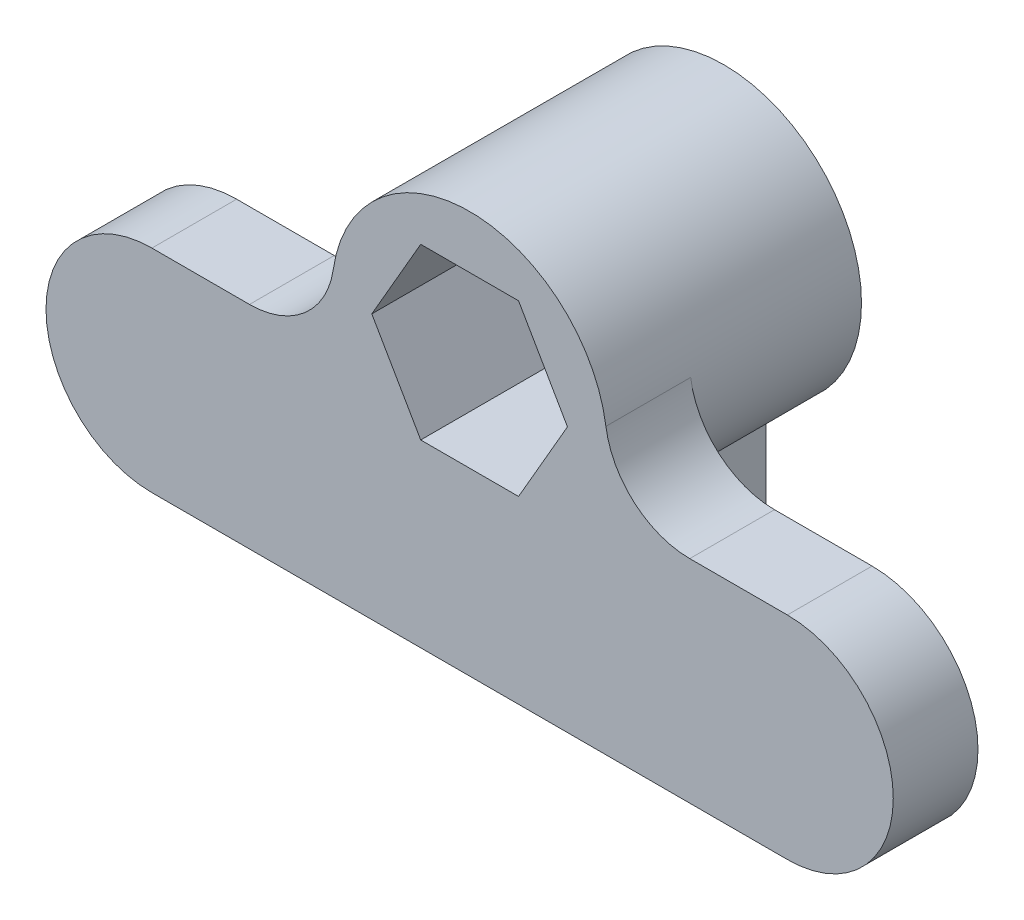
ISO-10303-21;
HEADER;
FILE_DESCRIPTION(('STEP AP214'),'2;1');
FILE_NAME('part.step','',(''),(''),'','','');
FILE_SCHEMA(('AUTOMOTIVE_DESIGN { 1 0 10303 214 1 1 1 1 }'));
ENDSEC;
DATA;
#1=APPLICATION_CONTEXT('core data for automotive mechanical design processes');
#2=APPLICATION_PROTOCOL_DEFINITION('international standard','automotive_design',2000,#1);
#3=PRODUCT_CONTEXT('',#1,'mechanical');
#4=PRODUCT('Part','Part','',(#3));
#5=PRODUCT_RELATED_PRODUCT_CATEGORY('part','',(#4));
#6=PRODUCT_DEFINITION_FORMATION('','',#4);
#7=PRODUCT_DEFINITION_CONTEXT('part definition',#1,'design');
#8=PRODUCT_DEFINITION('design','',#6,#7);
#9=PRODUCT_DEFINITION_SHAPE('','',#8);
#10=(LENGTH_UNIT() NAMED_UNIT(*) SI_UNIT(.MILLI.,.METRE.));
#11=(NAMED_UNIT(*) PLANE_ANGLE_UNIT() SI_UNIT($,.RADIAN.));
#12=(NAMED_UNIT(*) SI_UNIT($,.STERADIAN.) SOLID_ANGLE_UNIT());
#13=UNCERTAINTY_MEASURE_WITH_UNIT(LENGTH_MEASURE(1.E-05),#10,'distance_accuracy_value','');
#14=(GEOMETRIC_REPRESENTATION_CONTEXT(3) GLOBAL_UNCERTAINTY_ASSIGNED_CONTEXT((#13)) GLOBAL_UNIT_ASSIGNED_CONTEXT((#10,
#11,#12)) REPRESENTATION_CONTEXT('',''));
#15=CARTESIAN_POINT('',(0.,0.,0.));
#16=DIRECTION('',(0.,0.,1.));
#17=DIRECTION('',(1.,0.,0.));
#18=AXIS2_PLACEMENT_3D('',#15,#16,#17);
#19=CARTESIAN_POINT('',(0.,0.,6.));
#20=DIRECTION('',(0.,0.,-1.));
#21=DIRECTION('',(-1.,0.,0.));
#22=AXIS2_PLACEMENT_3D('',#19,#20,#21);
#23=CYLINDRICAL_SURFACE('',#22,1.25);
#24=CARTESIAN_POINT('',(0.,0.,2.));
#25=DIRECTION('',(0.,0.,1.));
#26=DIRECTION('',(1.,0.,0.));
#27=AXIS2_PLACEMENT_3D('',#24,#25,#26);
#28=CIRCLE('',#27,1.25);
#29=CARTESIAN_POINT('',(1.25,0.,2.));
#30=VERTEX_POINT('',#29);
#31=EDGE_CURVE('E327',#30,#30,#28,.T.);
#32=ORIENTED_EDGE('',*,*,#31,.F.);
#33=EDGE_LOOP('',(#32));
#34=FACE_BOUND('',#33,.T.);
#35=CARTESIAN_POINT('',(0.,0.,4.));
#36=DIRECTION('',(0.,0.,1.));
#37=DIRECTION('',(1.,0.,0.));
#38=AXIS2_PLACEMENT_3D('',#35,#36,#37);
#39=CIRCLE('',#38,1.25);
#40=CARTESIAN_POINT('',(1.25,0.,4.));
#41=VERTEX_POINT('',#40);
#42=EDGE_CURVE('E93',#41,#41,#39,.T.);
#43=ORIENTED_EDGE('',*,*,#42,.T.);
#44=EDGE_LOOP('',(#43));
#45=FACE_BOUND('',#44,.T.);
#46=ADVANCED_FACE('F89',(#34,#45),#23,.F.);
#47=CARTESIAN_POINT('',(0.,0.,2.));
#48=DIRECTION('',(0.,0.,1.));
#49=DIRECTION('',(1.,0.,0.));
#50=AXIS2_PLACEMENT_3D('',#47,#48,#49);
#51=PLANE('',#50);
#52=CARTESIAN_POINT('',(0.,0.,2.));
#53=DIRECTION('',(0.,0.,1.));
#54=DIRECTION('',(1.,0.,0.));
#55=AXIS2_PLACEMENT_3D('',#52,#53,#54);
#56=CIRCLE('',#55,3.25);
#57=CARTESIAN_POINT('',(1.,-3.09232921921325,2.));
#58=VERTEX_POINT('',#57);
#59=CARTESIAN_POINT('',(-1.,-3.09232921921325,2.));
#60=VERTEX_POINT('',#59);
#61=EDGE_CURVE('E363',#58,#60,#56,.T.);
#62=ORIENTED_EDGE('',*,*,#61,.F.);
#63=DIRECTION('',(0.,1.,0.));
#64=VECTOR('',#63,1.);
#65=CARTESIAN_POINT('',(1.,-3.09232921921325,2.));
#66=LINE('',#65,#64);
#67=CARTESIAN_POINT('',(1.,-6.25,2.));
#68=VERTEX_POINT('',#67);
#69=EDGE_CURVE('E385',#68,#58,#66,.T.);
#70=ORIENTED_EDGE('',*,*,#69,.F.);
#71=DIRECTION('',(1.,0.,0.));
#72=VECTOR('',#71,1.);
#73=CARTESIAN_POINT('',(-1.,-6.25,2.));
#74=LINE('',#73,#72);
#75=CARTESIAN_POINT('',(-1.,-6.25,2.));
#76=VERTEX_POINT('',#75);
#77=EDGE_CURVE('E382',#76,#68,#74,.T.);
#78=ORIENTED_EDGE('',*,*,#77,.F.);
#79=DIRECTION('',(0.,-1.,0.));
#80=VECTOR('',#79,1.);
#81=CARTESIAN_POINT('',(-1.,-3.09232921921325,2.));
#82=LINE('',#81,#80);
#83=EDGE_CURVE('E379',#60,#76,#82,.T.);
#84=ORIENTED_EDGE('',*,*,#83,.F.);
#85=EDGE_LOOP('',(#62,#70,#78,#84));
#86=FACE_BOUND('',#85,.T.);
#87=ORIENTED_EDGE('',*,*,#31,.T.);
#88=EDGE_LOOP('',(#87));
#89=FACE_BOUND('',#88,.T.);
#90=ADVANCED_FACE('F404',(#86,#89),#51,.F.);
#91=CARTESIAN_POINT('',(0.,0.,6.));
#92=DIRECTION('',(0.,0.,-1.));
#93=DIRECTION('',(-1.,0.,0.));
#94=AXIS2_PLACEMENT_3D('',#91,#92,#93);
#95=CYLINDRICAL_SURFACE('',#94,3.25);
#96=ORIENTED_EDGE('',*,*,#61,.T.);
#97=DIRECTION('',(0.,0.,-1.));
#98=VECTOR('',#97,1.);
#99=CARTESIAN_POINT('',(-1.,-3.09232921921325,6.));
#100=LINE('',#99,#98);
#101=CARTESIAN_POINT('',(-1.,-3.09232921921325,6.));
#102=VERTEX_POINT('',#101);
#103=EDGE_CURVE('E13',#102,#60,#100,.T.);
#104=ORIENTED_EDGE('',*,*,#103,.F.);
#105=CARTESIAN_POINT('',(0.,0.,6.));
#106=DIRECTION('',(0.,0.,1.));
#107=DIRECTION('',(1.,0.,0.));
#108=AXIS2_PLACEMENT_3D('',#105,#106,#107);
#109=CIRCLE('',#108,3.25);
#110=CARTESIAN_POINT('',(-3.21666578548506,0.464285714285714,6.));
#111=VERTEX_POINT('',#110);
#112=EDGE_CURVE('E114',#111,#102,#109,.T.);
#113=ORIENTED_EDGE('',*,*,#112,.F.);
#114=DIRECTION('',(0.,0.,-1.));
#115=VECTOR('',#114,1.);
#116=CARTESIAN_POINT('',(-3.21666578548506,0.464285714285714,7.));
#117=LINE('',#116,#115);
#118=CARTESIAN_POINT('',(-3.21666578548506,0.464285714285714,8.));
#119=VERTEX_POINT('',#118);
#120=EDGE_CURVE('E324',#119,#111,#117,.T.);
#121=ORIENTED_EDGE('',*,*,#120,.F.);
#122=CARTESIAN_POINT('',(0.,0.,8.));
#123=DIRECTION('',(0.,0.,1.));
#124=DIRECTION('',(1.,0.,0.));
#125=AXIS2_PLACEMENT_3D('',#122,#123,#124);
#126=CIRCLE('',#125,3.25);
#127=CARTESIAN_POINT('',(3.21666578548506,0.464285714285714,8.));
#128=VERTEX_POINT('',#127);
#129=EDGE_CURVE('E279',#128,#119,#126,.T.);
#130=ORIENTED_EDGE('',*,*,#129,.F.);
#131=DIRECTION('',(0.,0.,-1.));
#132=VECTOR('',#131,1.);
#133=CARTESIAN_POINT('',(3.21666578548506,0.464285714285714,8.));
#134=LINE('',#133,#132);
#135=CARTESIAN_POINT('',(3.21666578548506,0.464285714285714,6.));
#136=VERTEX_POINT('',#135);
#137=EDGE_CURVE('E320',#128,#136,#134,.T.);
#138=ORIENTED_EDGE('',*,*,#137,.T.);
#139=CARTESIAN_POINT('',(1.,-3.09232921921325,6.));
#140=VERTEX_POINT('',#139);
#141=EDGE_CURVE('E364',#140,#136,#109,.T.);
#142=ORIENTED_EDGE('',*,*,#141,.F.);
#143=DIRECTION('',(0.,0.,-1.));
#144=VECTOR('',#143,1.);
#145=CARTESIAN_POINT('',(1.,-3.09232921921325,6.));
#146=LINE('',#145,#144);
#147=EDGE_CURVE('E375',#140,#58,#146,.T.);
#148=ORIENTED_EDGE('',*,*,#147,.T.);
#149=EDGE_LOOP('',(#96,#104,#113,#121,#130,#138,#142,#148));
#150=FACE_BOUND('',#149,.T.);
#151=ADVANCED_FACE('F91',(#150),#95,.T.);
#152=CARTESIAN_POINT('',(-1.,-3.09232921921325,6.));
#153=DIRECTION('',(1.,0.,0.));
#154=DIRECTION('',(0.,1.,0.));
#155=AXIS2_PLACEMENT_3D('',#152,#153,#154);
#156=PLANE('',#155);
#157=ORIENTED_EDGE('',*,*,#83,.T.);
#158=DIRECTION('',(0.,0.,-1.));
#159=VECTOR('',#158,1.);
#160=CARTESIAN_POINT('',(-1.,-6.25,6.));
#161=LINE('',#160,#159);
#162=CARTESIAN_POINT('',(-1.,-6.25,6.));
#163=VERTEX_POINT('',#162);
#164=EDGE_CURVE('E99',#163,#76,#161,.T.);
#165=ORIENTED_EDGE('',*,*,#164,.F.);
#166=DIRECTION('',(0.,-1.,0.));
#167=VECTOR('',#166,1.);
#168=CARTESIAN_POINT('',(-1.,-3.09232921921325,6.));
#169=LINE('',#168,#167);
#170=EDGE_CURVE('E367',#102,#163,#169,.T.);
#171=ORIENTED_EDGE('',*,*,#170,.F.);
#172=ORIENTED_EDGE('',*,*,#103,.T.);
#173=EDGE_LOOP('',(#157,#165,#171,#172));
#174=FACE_BOUND('',#173,.T.);
#175=ADVANCED_FACE('F478',(#174),#156,.F.);
#176=CARTESIAN_POINT('',(-1.,-6.25,6.));
#177=DIRECTION('',(0.,1.,0.));
#178=DIRECTION('',(0.,0.,1.));
#179=AXIS2_PLACEMENT_3D('',#176,#177,#178);
#180=PLANE('',#179);
#181=ORIENTED_EDGE('',*,*,#77,.T.);
#182=DIRECTION('',(0.,0.,-1.));
#183=VECTOR('',#182,1.);
#184=CARTESIAN_POINT('',(1.,-6.25,6.));
#185=LINE('',#184,#183);
#186=CARTESIAN_POINT('',(1.,-6.25,6.));
#187=VERTEX_POINT('',#186);
#188=EDGE_CURVE('E391',#187,#68,#185,.T.);
#189=ORIENTED_EDGE('',*,*,#188,.F.);
#190=DIRECTION('',(1.,0.,0.));
#191=VECTOR('',#190,1.);
#192=CARTESIAN_POINT('',(0.,-6.25,6.));
#193=LINE('',#192,#191);
#194=CARTESIAN_POINT('',(7.5,-6.25,6.));
#195=VERTEX_POINT('',#194);
#196=EDGE_CURVE('E298',#187,#195,#193,.T.);
#197=ORIENTED_EDGE('',*,*,#196,.T.);
#198=DIRECTION('',(0.,0.,-1.));
#199=VECTOR('',#198,1.);
#200=CARTESIAN_POINT('',(7.5,-6.25,8.));
#201=LINE('',#200,#199);
#202=CARTESIAN_POINT('',(7.5,-6.25,8.));
#203=VERTEX_POINT('',#202);
#204=EDGE_CURVE('E316',#203,#195,#201,.T.);
#205=ORIENTED_EDGE('',*,*,#204,.F.);
#206=DIRECTION('',(1.,0.,0.));
#207=VECTOR('',#206,1.);
#208=CARTESIAN_POINT('',(0.,-6.25,8.));
#209=LINE('',#208,#207);
#210=CARTESIAN_POINT('',(-7.5,-6.25,8.));
#211=VERTEX_POINT('',#210);
#212=EDGE_CURVE('E284',#211,#203,#209,.T.);
#213=ORIENTED_EDGE('',*,*,#212,.F.);
#214=DIRECTION('',(0.,0.,-1.));
#215=VECTOR('',#214,1.);
#216=CARTESIAN_POINT('',(-7.5,-6.25,8.));
#217=LINE('',#216,#215);
#218=CARTESIAN_POINT('',(-7.5,-6.25,6.));
#219=VERTEX_POINT('',#218);
#220=EDGE_CURVE('E340',#211,#219,#217,.T.);
#221=ORIENTED_EDGE('',*,*,#220,.T.);
#222=EDGE_CURVE('E300',#219,#163,#193,.T.);
#223=ORIENTED_EDGE('',*,*,#222,.T.);
#224=ORIENTED_EDGE('',*,*,#164,.T.);
#225=EDGE_LOOP('',(#181,#189,#197,#205,#213,#221,#223,#224));
#226=FACE_BOUND('',#225,.T.);
#227=ADVANCED_FACE('F399',(#226),#180,.F.);
#228=CARTESIAN_POINT('',(1.,-3.09232921921325,6.));
#229=DIRECTION('',(-1.,0.,0.));
#230=DIRECTION('',(0.,-1.,0.));
#231=AXIS2_PLACEMENT_3D('',#228,#229,#230);
#232=PLANE('',#231);
#233=ORIENTED_EDGE('',*,*,#69,.T.);
#234=ORIENTED_EDGE('',*,*,#147,.F.);
#235=DIRECTION('',(0.,1.,0.));
#236=VECTOR('',#235,1.);
#237=CARTESIAN_POINT('',(1.,-3.09232921921325,6.));
#238=LINE('',#237,#236);
#239=EDGE_CURVE('E371',#187,#140,#238,.T.);
#240=ORIENTED_EDGE('',*,*,#239,.F.);
#241=ORIENTED_EDGE('',*,*,#188,.T.);
#242=EDGE_LOOP('',(#233,#234,#240,#241));
#243=FACE_BOUND('',#242,.T.);
#244=ADVANCED_FACE('F408',(#243),#232,.F.);
#245=CARTESIAN_POINT('',(0.,0.,6.));
#246=DIRECTION('',(0.,0.,1.));
#247=DIRECTION('',(1.,0.,0.));
#248=AXIS2_PLACEMENT_3D('',#245,#246,#247);
#249=PLANE('',#248);
#250=CARTESIAN_POINT('',(-5.19615242270663,0.75,6.));
#251=DIRECTION('',(0.,0.,1.));
#252=DIRECTION('',(1.,0.,0.));
#253=AXIS2_PLACEMENT_3D('',#250,#251,#252);
#254=CIRCLE('',#253,2.);
#255=CARTESIAN_POINT('',(-5.19615242270663,-1.25,6.));
#256=VERTEX_POINT('',#255);
#257=EDGE_CURVE('E333',#256,#111,#254,.T.);
#258=ORIENTED_EDGE('',*,*,#257,.T.);
#259=ORIENTED_EDGE('',*,*,#112,.T.);
#260=ORIENTED_EDGE('',*,*,#170,.T.);
#261=ORIENTED_EDGE('',*,*,#222,.F.);
#262=CARTESIAN_POINT('',(-7.5,-3.75,6.));
#263=DIRECTION('',(0.,0.,1.));
#264=DIRECTION('',(1.,0.,0.));
#265=AXIS2_PLACEMENT_3D('',#262,#263,#264);
#266=CIRCLE('',#265,2.5);
#267=CARTESIAN_POINT('',(-7.5,-1.25,6.));
#268=VERTEX_POINT('',#267);
#269=EDGE_CURVE('E341',#268,#219,#266,.T.);
#270=ORIENTED_EDGE('',*,*,#269,.F.);
#271=DIRECTION('',(-1.,0.,0.));
#272=VECTOR('',#271,1.);
#273=CARTESIAN_POINT('',(-5.19615242270663,-1.25,6.));
#274=LINE('',#273,#272);
#275=EDGE_CURVE('E345',#256,#268,#274,.T.);
#276=ORIENTED_EDGE('',*,*,#275,.F.);
#277=EDGE_LOOP('',(#258,#259,#260,#261,#270,#276));
#278=FACE_BOUND('',#277,.T.);
#279=ADVANCED_FACE('F476',(#278),#249,.F.);
#280=ORIENTED_EDGE('',*,*,#239,.T.);
#281=ORIENTED_EDGE('',*,*,#141,.T.);
#282=CARTESIAN_POINT('',(5.19615242270663,0.75,6.));
#283=DIRECTION('',(0.,0.,1.));
#284=DIRECTION('',(1.,0.,0.));
#285=AXIS2_PLACEMENT_3D('',#282,#283,#284);
#286=CIRCLE('',#285,2.);
#287=CARTESIAN_POINT('',(5.19615242270663,-1.25,6.));
#288=VERTEX_POINT('',#287);
#289=EDGE_CURVE('E294',#136,#288,#286,.T.);
#290=ORIENTED_EDGE('',*,*,#289,.T.);
#291=DIRECTION('',(-1.,0.,0.));
#292=VECTOR('',#291,1.);
#293=CARTESIAN_POINT('',(0.,-1.25,6.));
#294=LINE('',#293,#292);
#295=CARTESIAN_POINT('',(7.5,-1.25,6.));
#296=VERTEX_POINT('',#295);
#297=EDGE_CURVE('E280',#296,#288,#294,.T.);
#298=ORIENTED_EDGE('',*,*,#297,.F.);
#299=CARTESIAN_POINT('',(7.5,-3.75,6.));
#300=DIRECTION('',(0.,0.,1.));
#301=DIRECTION('',(1.,0.,0.));
#302=AXIS2_PLACEMENT_3D('',#299,#300,#301);
#303=CIRCLE('',#302,2.5);
#304=EDGE_CURVE('E304',#195,#296,#303,.T.);
#305=ORIENTED_EDGE('',*,*,#304,.F.);
#306=ORIENTED_EDGE('',*,*,#196,.F.);
#307=EDGE_LOOP('',(#280,#281,#290,#298,#305,#306));
#308=FACE_BOUND('',#307,.T.);
#309=ADVANCED_FACE('F413',(#308),#249,.F.);
#310=CARTESIAN_POINT('',(0.,-1.25,8.));
#311=DIRECTION('',(0.,-1.,0.));
#312=DIRECTION('',(1.,0.,0.));
#313=AXIS2_PLACEMENT_3D('',#310,#311,#312);
#314=PLANE('',#313);
#315=ORIENTED_EDGE('',*,*,#297,.T.);
#316=DIRECTION('',(0.,0.,-1.));
#317=VECTOR('',#316,1.);
#318=CARTESIAN_POINT('',(5.19615242270663,-1.25,8.));
#319=LINE('',#318,#317);
#320=CARTESIAN_POINT('',(5.19615242270663,-1.25,8.));
#321=VERTEX_POINT('',#320);
#322=EDGE_CURVE('E293',#321,#288,#319,.T.);
#323=ORIENTED_EDGE('',*,*,#322,.F.);
#324=DIRECTION('',(-1.,0.,0.));
#325=VECTOR('',#324,1.);
#326=CARTESIAN_POINT('',(0.,-1.25,8.));
#327=LINE('',#326,#325);
#328=CARTESIAN_POINT('',(7.5,-1.25,8.));
#329=VERTEX_POINT('',#328);
#330=EDGE_CURVE('E290',#329,#321,#327,.T.);
#331=ORIENTED_EDGE('',*,*,#330,.F.);
#332=DIRECTION('',(0.,0.,-1.));
#333=VECTOR('',#332,1.);
#334=CARTESIAN_POINT('',(7.5,-1.25,8.));
#335=LINE('',#334,#333);
#336=EDGE_CURVE('E312',#329,#296,#335,.T.);
#337=ORIENTED_EDGE('',*,*,#336,.T.);
#338=EDGE_LOOP('',(#315,#323,#331,#337));
#339=FACE_BOUND('',#338,.T.);
#340=ADVANCED_FACE('F496',(#339),#314,.F.);
#341=CARTESIAN_POINT('',(7.5,-3.75,8.));
#342=DIRECTION('',(0.,0.,-1.));
#343=DIRECTION('',(-1.,0.,0.));
#344=AXIS2_PLACEMENT_3D('',#341,#342,#343);
#345=CYLINDRICAL_SURFACE('',#344,2.5);
#346=ORIENTED_EDGE('',*,*,#304,.T.);
#347=ORIENTED_EDGE('',*,*,#336,.F.);
#348=CARTESIAN_POINT('',(7.5,-3.75,8.));
#349=DIRECTION('',(0.,0.,1.));
#350=DIRECTION('',(1.,0.,0.));
#351=AXIS2_PLACEMENT_3D('',#348,#349,#350);
#352=CIRCLE('',#351,2.5);
#353=EDGE_CURVE('E287',#203,#329,#352,.T.);
#354=ORIENTED_EDGE('',*,*,#353,.F.);
#355=ORIENTED_EDGE('',*,*,#204,.T.);
#356=EDGE_LOOP('',(#346,#347,#354,#355));
#357=FACE_BOUND('',#356,.T.);
#358=ADVANCED_FACE('F500',(#357),#345,.T.);
#359=CARTESIAN_POINT('',(5.19615242270663,0.75,8.));
#360=DIRECTION('',(0.,0.,-1.));
#361=DIRECTION('',(-1.,0.,0.));
#362=AXIS2_PLACEMENT_3D('',#359,#360,#361);
#363=CYLINDRICAL_SURFACE('',#362,2.);
#364=ORIENTED_EDGE('',*,*,#289,.F.);
#365=ORIENTED_EDGE('',*,*,#137,.F.);
#366=CARTESIAN_POINT('',(5.19615242270663,0.75,8.));
#367=DIRECTION('',(0.,0.,1.));
#368=DIRECTION('',(1.,0.,0.));
#369=AXIS2_PLACEMENT_3D('',#366,#367,#368);
#370=CIRCLE('',#369,2.);
#371=EDGE_CURVE('E275',#128,#321,#370,.T.);
#372=ORIENTED_EDGE('',*,*,#371,.T.);
#373=ORIENTED_EDGE('',*,*,#322,.T.);
#374=EDGE_LOOP('',(#364,#365,#372,#373));
#375=FACE_BOUND('',#374,.T.);
#376=ADVANCED_FACE('F494',(#375),#363,.F.);
#377=CARTESIAN_POINT('',(0.,0.,8.));
#378=DIRECTION('',(0.,0.,1.));
#379=DIRECTION('',(1.,0.,0.));
#380=AXIS2_PLACEMENT_3D('',#377,#378,#379);
#381=PLANE('',#380);
#382=DIRECTION('',(-0.5,0.866025403784438,0.));
#383=VECTOR('',#382,1.);
#384=CARTESIAN_POINT('',(2.3094010767585,0.,8.));
#385=LINE('',#384,#383);
#386=CARTESIAN_POINT('',(2.3094010767585,0.,8.));
#387=VERTEX_POINT('',#386);
#388=CARTESIAN_POINT('',(1.15470053837925,2.,8.));
#389=VERTEX_POINT('',#388);
#390=EDGE_CURVE('E106',#387,#389,#385,.T.);
#391=ORIENTED_EDGE('',*,*,#390,.F.);
#392=DIRECTION('',(0.5,0.866025403784439,0.));
#393=VECTOR('',#392,1.);
#394=CARTESIAN_POINT('',(1.15470053837925,-2.,8.));
#395=LINE('',#394,#393);
#396=CARTESIAN_POINT('',(1.15470053837925,-2.,8.));
#397=VERTEX_POINT('',#396);
#398=EDGE_CURVE('E254',#397,#387,#395,.T.);
#399=ORIENTED_EDGE('',*,*,#398,.F.);
#400=DIRECTION('',(1.,0.,0.));
#401=VECTOR('',#400,1.);
#402=CARTESIAN_POINT('',(-1.15470053837925,-2.,8.));
#403=LINE('',#402,#401);
#404=CARTESIAN_POINT('',(-1.15470053837925,-2.,8.));
#405=VERTEX_POINT('',#404);
#406=EDGE_CURVE('E247',#405,#397,#403,.T.);
#407=ORIENTED_EDGE('',*,*,#406,.F.);
#408=DIRECTION('',(0.5,-0.866025403784438,0.));
#409=VECTOR('',#408,1.);
#410=CARTESIAN_POINT('',(-2.3094010767585,0.,8.));
#411=LINE('',#410,#409);
#412=CARTESIAN_POINT('',(-2.3094010767585,0.,8.));
#413=VERTEX_POINT('',#412);
#414=EDGE_CURVE('E243',#413,#405,#411,.T.);
#415=ORIENTED_EDGE('',*,*,#414,.F.);
#416=DIRECTION('',(-0.5,-0.866025403784439,0.));
#417=VECTOR('',#416,1.);
#418=CARTESIAN_POINT('',(-1.15470053837925,2.,8.));
#419=LINE('',#418,#417);
#420=CARTESIAN_POINT('',(-1.15470053837925,2.,8.));
#421=VERTEX_POINT('',#420);
#422=EDGE_CURVE('E223',#421,#413,#419,.T.);
#423=ORIENTED_EDGE('',*,*,#422,.F.);
#424=DIRECTION('',(-1.,0.,0.));
#425=VECTOR('',#424,1.);
#426=CARTESIAN_POINT('',(1.15470053837925,2.,8.));
#427=LINE('',#426,#425);
#428=EDGE_CURVE('E234',#389,#421,#427,.T.);
#429=ORIENTED_EDGE('',*,*,#428,.F.);
#430=EDGE_LOOP('',(#391,#399,#407,#415,#423,#429));
#431=FACE_BOUND('',#430,.T.);
#432=ORIENTED_EDGE('',*,*,#371,.F.);
#433=ORIENTED_EDGE('',*,*,#129,.T.);
#434=CARTESIAN_POINT('',(-5.19615242270663,0.75,8.));
#435=DIRECTION('',(0.,0.,1.));
#436=DIRECTION('',(1.,0.,0.));
#437=AXIS2_PLACEMENT_3D('',#434,#435,#436);
#438=CIRCLE('',#437,2.);
#439=CARTESIAN_POINT('',(-5.19615242270663,-1.25,8.));
#440=VERTEX_POINT('',#439);
#441=EDGE_CURVE('E336',#440,#119,#438,.T.);
#442=ORIENTED_EDGE('',*,*,#441,.F.);
#443=DIRECTION('',(-1.,0.,0.));
#444=VECTOR('',#443,1.);
#445=CARTESIAN_POINT('',(-5.19615242270663,-1.25,8.));
#446=LINE('',#445,#444);
#447=CARTESIAN_POINT('',(-7.5,-1.25,8.));
#448=VERTEX_POINT('',#447);
#449=EDGE_CURVE('E332',#440,#448,#446,.T.);
#450=ORIENTED_EDGE('',*,*,#449,.T.);
#451=CARTESIAN_POINT('',(-7.5,-3.75,8.));
#452=DIRECTION('',(0.,0.,1.));
#453=DIRECTION('',(1.,0.,0.));
#454=AXIS2_PLACEMENT_3D('',#451,#452,#453);
#455=CIRCLE('',#454,2.5);
#456=EDGE_CURVE('E328',#448,#211,#455,.T.);
#457=ORIENTED_EDGE('',*,*,#456,.T.);
#458=ORIENTED_EDGE('',*,*,#212,.T.);
#459=ORIENTED_EDGE('',*,*,#353,.T.);
#460=ORIENTED_EDGE('',*,*,#330,.T.);
#461=EDGE_LOOP('',(#432,#433,#442,#450,#457,#458,#459,#460));
#462=FACE_BOUND('',#461,.T.);
#463=ADVANCED_FACE('F239',(#431,#462),#381,.T.);
#464=CARTESIAN_POINT('',(-5.19615242270663,-1.25,8.));
#465=DIRECTION('',(0.,-1.,0.));
#466=DIRECTION('',(1.,0.,0.));
#467=AXIS2_PLACEMENT_3D('',#464,#465,#466);
#468=PLANE('',#467);
#469=ORIENTED_EDGE('',*,*,#275,.T.);
#470=DIRECTION('',(0.,0.,-1.));
#471=VECTOR('',#470,1.);
#472=CARTESIAN_POINT('',(-7.5,-1.25,8.));
#473=LINE('',#472,#471);
#474=EDGE_CURVE('E353',#448,#268,#473,.T.);
#475=ORIENTED_EDGE('',*,*,#474,.F.);
#476=ORIENTED_EDGE('',*,*,#449,.F.);
#477=DIRECTION('',(0.,0.,-1.));
#478=VECTOR('',#477,1.);
#479=CARTESIAN_POINT('',(-5.19615242270663,-1.25,8.));
#480=LINE('',#479,#478);
#481=EDGE_CURVE('E299',#440,#256,#480,.T.);
#482=ORIENTED_EDGE('',*,*,#481,.T.);
#483=EDGE_LOOP('',(#469,#475,#476,#482));
#484=FACE_BOUND('',#483,.T.);
#485=ADVANCED_FACE('F506',(#484),#468,.F.);
#486=CARTESIAN_POINT('',(-7.5,-3.75,8.));
#487=DIRECTION('',(0.,0.,-1.));
#488=DIRECTION('',(-1.,0.,0.));
#489=AXIS2_PLACEMENT_3D('',#486,#487,#488);
#490=CYLINDRICAL_SURFACE('',#489,2.5);
#491=ORIENTED_EDGE('',*,*,#269,.T.);
#492=ORIENTED_EDGE('',*,*,#220,.F.);
#493=ORIENTED_EDGE('',*,*,#456,.F.);
#494=ORIENTED_EDGE('',*,*,#474,.T.);
#495=EDGE_LOOP('',(#491,#492,#493,#494));
#496=FACE_BOUND('',#495,.T.);
#497=ADVANCED_FACE('F457',(#496),#490,.T.);
#498=CARTESIAN_POINT('',(-5.19615242270663,0.75,8.));
#499=DIRECTION('',(0.,0.,-1.));
#500=DIRECTION('',(-1.,0.,0.));
#501=AXIS2_PLACEMENT_3D('',#498,#499,#500);
#502=CYLINDRICAL_SURFACE('',#501,2.);
#503=ORIENTED_EDGE('',*,*,#257,.F.);
#504=ORIENTED_EDGE('',*,*,#481,.F.);
#505=ORIENTED_EDGE('',*,*,#441,.T.);
#506=ORIENTED_EDGE('',*,*,#120,.T.);
#507=EDGE_LOOP('',(#503,#504,#505,#506));
#508=FACE_BOUND('',#507,.T.);
#509=ADVANCED_FACE('F448',(#508),#502,.F.);
#510=CARTESIAN_POINT('',(2.3094010767585,0.,-4.11010092660779));
#511=DIRECTION('',(0.866025403784438,0.5,0.));
#512=DIRECTION('',(-0.5,0.866025403784439,0.));
#513=AXIS2_PLACEMENT_3D('',#510,#511,#512);
#514=PLANE('',#513);
#515=DIRECTION('',(0.5,-0.866025403784439,0.));
#516=VECTOR('',#515,1.);
#517=CARTESIAN_POINT('',(2.3094010767585,0.,4.));
#518=LINE('',#517,#516);
#519=CARTESIAN_POINT('',(1.15470053837925,2.,4.));
#520=VERTEX_POINT('',#519);
#521=CARTESIAN_POINT('',(2.3094010767585,0.,4.));
#522=VERTEX_POINT('',#521);
#523=EDGE_CURVE('E274',#520,#522,#518,.T.);
#524=ORIENTED_EDGE('',*,*,#523,.T.);
#525=DIRECTION('',(0.,0.,1.));
#526=VECTOR('',#525,1.);
#527=CARTESIAN_POINT('',(2.3094010767585,0.,-4.11010092660779));
#528=LINE('',#527,#526);
#529=EDGE_CURVE('E258',#522,#387,#528,.T.);
#530=ORIENTED_EDGE('',*,*,#529,.T.);
#531=ORIENTED_EDGE('',*,*,#390,.T.);
#532=DIRECTION('',(0.,0.,1.));
#533=VECTOR('',#532,1.);
#534=CARTESIAN_POINT('',(1.15470053837925,2.,-4.11010092660779));
#535=LINE('',#534,#533);
#536=EDGE_CURVE('E231',#520,#389,#535,.T.);
#537=ORIENTED_EDGE('',*,*,#536,.F.);
#538=EDGE_LOOP('',(#524,#530,#531,#537));
#539=FACE_BOUND('',#538,.T.);
#540=ADVANCED_FACE('F445',(#539),#514,.F.);
#541=CARTESIAN_POINT('',(1.15470053837925,-2.,-4.11010092660779));
#542=DIRECTION('',(0.866025403784439,-0.5,0.));
#543=DIRECTION('',(0.5,0.866025403784439,0.));
#544=AXIS2_PLACEMENT_3D('',#541,#542,#543);
#545=PLANE('',#544);
#546=DIRECTION('',(-0.5,-0.866025403784439,0.));
#547=VECTOR('',#546,1.);
#548=CARTESIAN_POINT('',(1.15470053837925,-2.,4.));
#549=LINE('',#548,#547);
#550=CARTESIAN_POINT('',(1.15470053837925,-2.,4.));
#551=VERTEX_POINT('',#550);
#552=EDGE_CURVE('E423',#522,#551,#549,.T.);
#553=ORIENTED_EDGE('',*,*,#552,.T.);
#554=DIRECTION('',(0.,0.,1.));
#555=VECTOR('',#554,1.);
#556=CARTESIAN_POINT('',(1.15470053837925,-2.,-4.11010092660779));
#557=LINE('',#556,#555);
#558=EDGE_CURVE('E261',#551,#397,#557,.T.);
#559=ORIENTED_EDGE('',*,*,#558,.T.);
#560=ORIENTED_EDGE('',*,*,#398,.T.);
#561=ORIENTED_EDGE('',*,*,#529,.F.);
#562=EDGE_LOOP('',(#553,#559,#560,#561));
#563=FACE_BOUND('',#562,.T.);
#564=ADVANCED_FACE('F447',(#563),#545,.F.);
#565=CARTESIAN_POINT('',(-1.15470053837925,-2.,-4.11010092660779));
#566=DIRECTION('',(0.,-1.,0.));
#567=DIRECTION('',(1.,0.,0.));
#568=AXIS2_PLACEMENT_3D('',#565,#566,#567);
#569=PLANE('',#568);
#570=DIRECTION('',(-1.,0.,0.));
#571=VECTOR('',#570,1.);
#572=CARTESIAN_POINT('',(-1.15470053837925,-2.,4.));
#573=LINE('',#572,#571);
#574=CARTESIAN_POINT('',(-1.15470053837925,-2.,4.));
#575=VERTEX_POINT('',#574);
#576=EDGE_CURVE('E426',#551,#575,#573,.T.);
#577=ORIENTED_EDGE('',*,*,#576,.T.);
#578=DIRECTION('',(0.,0.,1.));
#579=VECTOR('',#578,1.);
#580=CARTESIAN_POINT('',(-1.15470053837925,-2.,-4.11010092660779));
#581=LINE('',#580,#579);
#582=EDGE_CURVE('E264',#575,#405,#581,.T.);
#583=ORIENTED_EDGE('',*,*,#582,.T.);
#584=ORIENTED_EDGE('',*,*,#406,.T.);
#585=ORIENTED_EDGE('',*,*,#558,.F.);
#586=EDGE_LOOP('',(#577,#583,#584,#585));
#587=FACE_BOUND('',#586,.T.);
#588=ADVANCED_FACE('F454',(#587),#569,.F.);
#589=CARTESIAN_POINT('',(-2.3094010767585,0.,-4.11010092660779));
#590=DIRECTION('',(-0.866025403784438,-0.5,0.));
#591=DIRECTION('',(0.5,-0.866025403784438,0.));
#592=AXIS2_PLACEMENT_3D('',#589,#590,#591);
#593=PLANE('',#592);
#594=DIRECTION('',(-0.5,0.866025403784438,0.));
#595=VECTOR('',#594,1.);
#596=CARTESIAN_POINT('',(-2.3094010767585,0.,4.));
#597=LINE('',#596,#595);
#598=CARTESIAN_POINT('',(-2.3094010767585,0.,4.));
#599=VERTEX_POINT('',#598);
#600=EDGE_CURVE('E429',#575,#599,#597,.T.);
#601=ORIENTED_EDGE('',*,*,#600,.T.);
#602=DIRECTION('',(0.,0.,1.));
#603=VECTOR('',#602,1.);
#604=CARTESIAN_POINT('',(-2.3094010767585,0.,-4.11010092660779));
#605=LINE('',#604,#603);
#606=EDGE_CURVE('E230',#599,#413,#605,.T.);
#607=ORIENTED_EDGE('',*,*,#606,.T.);
#608=ORIENTED_EDGE('',*,*,#414,.T.);
#609=ORIENTED_EDGE('',*,*,#582,.F.);
#610=EDGE_LOOP('',(#601,#607,#608,#609));
#611=FACE_BOUND('',#610,.T.);
#612=ADVANCED_FACE('F438',(#611),#593,.F.);
#613=CARTESIAN_POINT('',(-1.15470053837925,2.,-4.11010092660779));
#614=DIRECTION('',(-0.866025403784439,0.5,0.));
#615=DIRECTION('',(-0.5,-0.866025403784439,0.));
#616=AXIS2_PLACEMENT_3D('',#613,#614,#615);
#617=PLANE('',#616);
#618=DIRECTION('',(0.5,0.866025403784439,0.));
#619=VECTOR('',#618,1.);
#620=CARTESIAN_POINT('',(-1.15470053837925,2.,4.));
#621=LINE('',#620,#619);
#622=CARTESIAN_POINT('',(-1.15470053837925,2.,4.));
#623=VERTEX_POINT('',#622);
#624=EDGE_CURVE('E226',#599,#623,#621,.T.);
#625=ORIENTED_EDGE('',*,*,#624,.T.);
#626=DIRECTION('',(0.,0.,1.));
#627=VECTOR('',#626,1.);
#628=CARTESIAN_POINT('',(-1.15470053837925,2.,-4.11010092660779));
#629=LINE('',#628,#627);
#630=EDGE_CURVE('E218',#623,#421,#629,.T.);
#631=ORIENTED_EDGE('',*,*,#630,.T.);
#632=ORIENTED_EDGE('',*,*,#422,.T.);
#633=ORIENTED_EDGE('',*,*,#606,.F.);
#634=EDGE_LOOP('',(#625,#631,#632,#633));
#635=FACE_BOUND('',#634,.T.);
#636=ADVANCED_FACE('F220',(#635),#617,.F.);
#637=CARTESIAN_POINT('',(1.15470053837925,2.,-4.11010092660779));
#638=DIRECTION('',(0.,1.,0.));
#639=DIRECTION('',(0.,0.,1.));
#640=AXIS2_PLACEMENT_3D('',#637,#638,#639);
#641=PLANE('',#640);
#642=DIRECTION('',(1.,0.,0.));
#643=VECTOR('',#642,1.);
#644=CARTESIAN_POINT('',(1.15470053837925,2.,4.));
#645=LINE('',#644,#643);
#646=EDGE_CURVE('E271',#623,#520,#645,.T.);
#647=ORIENTED_EDGE('',*,*,#646,.T.);
#648=ORIENTED_EDGE('',*,*,#536,.T.);
#649=ORIENTED_EDGE('',*,*,#428,.T.);
#650=ORIENTED_EDGE('',*,*,#630,.F.);
#651=EDGE_LOOP('',(#647,#648,#649,#650));
#652=FACE_BOUND('',#651,.T.);
#653=ADVANCED_FACE('F235',(#652),#641,.F.);
#654=CARTESIAN_POINT('',(0.,0.,4.));
#655=DIRECTION('',(0.,0.,1.));
#656=DIRECTION('',(1.,0.,0.));
#657=AXIS2_PLACEMENT_3D('',#654,#655,#656);
#658=PLANE('',#657);
#659=ORIENTED_EDGE('',*,*,#42,.F.);
#660=EDGE_LOOP('',(#659));
#661=FACE_BOUND('',#660,.T.);
#662=ORIENTED_EDGE('',*,*,#523,.F.);
#663=ORIENTED_EDGE('',*,*,#646,.F.);
#664=ORIENTED_EDGE('',*,*,#624,.F.);
#665=ORIENTED_EDGE('',*,*,#600,.F.);
#666=ORIENTED_EDGE('',*,*,#576,.F.);
#667=ORIENTED_EDGE('',*,*,#552,.F.);
#668=EDGE_LOOP('',(#662,#663,#664,#665,#666,#667));
#669=FACE_BOUND('',#668,.T.);
#670=ADVANCED_FACE('F442',(#661,#669),#658,.T.);
#671=CLOSED_SHELL('',(#46,#90,#151,#175,#227,#244,#279,#309,#340,#358,#376,#463,#485,#497,#509,
#540,#564,#588,#612,#636,#653,#670));
#672=MANIFOLD_SOLID_BREP('B2',#671);
#673=ADVANCED_BREP_SHAPE_REPRESENTATION('',(#18,#672),#14);
#674=SHAPE_DEFINITION_REPRESENTATION(#9,#673);
ENDSEC;
END-ISO-10303-21;
